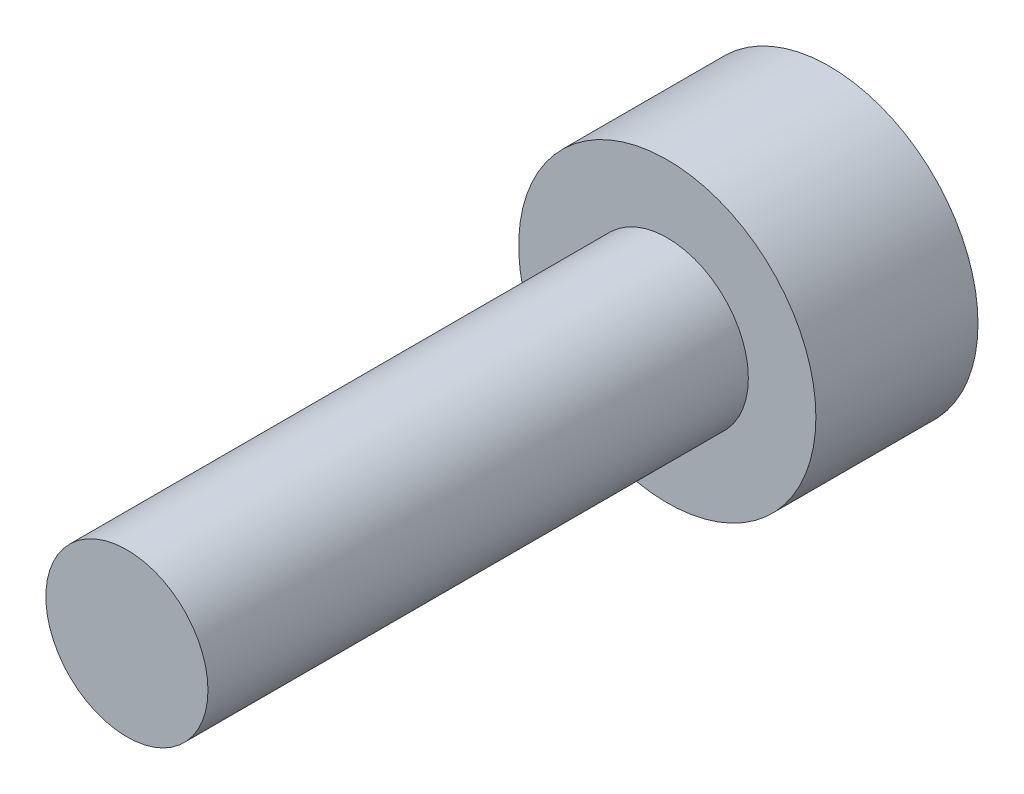
ISO-10303-21;
HEADER;
FILE_DESCRIPTION(('STEP AP214'),'2;1');
FILE_NAME('part.step','',(''),(''),'','','');
FILE_SCHEMA(('AUTOMOTIVE_DESIGN { 1 0 10303 214 1 1 1 1 }'));
ENDSEC;
DATA;
#1=APPLICATION_CONTEXT('core data for automotive mechanical design processes');
#2=APPLICATION_PROTOCOL_DEFINITION('international standard','automotive_design',2000,#1);
#3=PRODUCT_CONTEXT('',#1,'mechanical');
#4=PRODUCT('Part','Part','',(#3));
#5=PRODUCT_RELATED_PRODUCT_CATEGORY('part','',(#4));
#6=PRODUCT_DEFINITION_FORMATION('','',#4);
#7=PRODUCT_DEFINITION_CONTEXT('part definition',#1,'design');
#8=PRODUCT_DEFINITION('design','',#6,#7);
#9=PRODUCT_DEFINITION_SHAPE('','',#8);
#10=(LENGTH_UNIT() NAMED_UNIT(*) SI_UNIT(.MILLI.,.METRE.));
#11=(NAMED_UNIT(*) PLANE_ANGLE_UNIT() SI_UNIT($,.RADIAN.));
#12=(NAMED_UNIT(*) SI_UNIT($,.STERADIAN.) SOLID_ANGLE_UNIT());
#13=UNCERTAINTY_MEASURE_WITH_UNIT(LENGTH_MEASURE(1.E-05),#10,'distance_accuracy_value','');
#14=(GEOMETRIC_REPRESENTATION_CONTEXT(3) GLOBAL_UNCERTAINTY_ASSIGNED_CONTEXT((#13)) GLOBAL_UNIT_ASSIGNED_CONTEXT((#10,
#11,#12)) REPRESENTATION_CONTEXT('',''));
#15=CARTESIAN_POINT('',(0.,0.,0.));
#16=DIRECTION('',(0.,0.,1.));
#17=DIRECTION('',(1.,0.,0.));
#18=AXIS2_PLACEMENT_3D('',#15,#16,#17);
#19=CARTESIAN_POINT('',(0.,0.,3.));
#20=DIRECTION('',(0.,0.,1.));
#21=DIRECTION('',(1.,0.,0.));
#22=AXIS2_PLACEMENT_3D('',#19,#20,#21);
#23=PLANE('',#22);
#24=CARTESIAN_POINT('',(0.,0.,3.));
#25=DIRECTION('',(0.,0.,1.));
#26=DIRECTION('',(1.,0.,0.));
#27=AXIS2_PLACEMENT_3D('',#24,#25,#26);
#28=CIRCLE('',#27,2.75);
#29=CARTESIAN_POINT('',(2.75,0.,3.));
#30=VERTEX_POINT('',#29);
#31=EDGE_CURVE('E11',#30,#30,#28,.T.);
#32=ORIENTED_EDGE('',*,*,#31,.T.);
#33=EDGE_LOOP('',(#32));
#34=FACE_BOUND('',#33,.T.);
#35=CARTESIAN_POINT('',(0.,0.,3.));
#36=DIRECTION('',(0.,0.,1.));
#37=DIRECTION('',(1.,0.,0.));
#38=AXIS2_PLACEMENT_3D('',#35,#36,#37);
#39=CIRCLE('',#38,1.5);
#40=CARTESIAN_POINT('',(1.5,0.,3.));
#41=VERTEX_POINT('',#40);
#42=EDGE_CURVE('E139',#41,#41,#39,.T.);
#43=ORIENTED_EDGE('',*,*,#42,.F.);
#44=EDGE_LOOP('',(#43));
#45=FACE_BOUND('',#44,.T.);
#46=ADVANCED_FACE('F37',(#34,#45),#23,.T.);
#47=CARTESIAN_POINT('',(0.,0.,3.));
#48=DIRECTION('',(0.,0.,-1.));
#49=DIRECTION('',(-1.,0.,0.));
#50=AXIS2_PLACEMENT_3D('',#47,#48,#49);
#51=CYLINDRICAL_SURFACE('',#50,2.75);
#52=ORIENTED_EDGE('',*,*,#31,.F.);
#53=EDGE_LOOP('',(#52));
#54=FACE_BOUND('',#53,.T.);
#55=CARTESIAN_POINT('',(0.,0.,0.));
#56=DIRECTION('',(0.,0.,1.));
#57=DIRECTION('',(1.,0.,0.));
#58=AXIS2_PLACEMENT_3D('',#55,#56,#57);
#59=CIRCLE('',#58,2.75);
#60=CARTESIAN_POINT('',(2.75,0.,0.));
#61=VERTEX_POINT('',#60);
#62=EDGE_CURVE('E41',#61,#61,#59,.T.);
#63=ORIENTED_EDGE('',*,*,#62,.T.);
#64=EDGE_LOOP('',(#63));
#65=FACE_BOUND('',#64,.T.);
#66=ADVANCED_FACE('F39',(#54,#65),#51,.T.);
#67=CARTESIAN_POINT('',(0.,0.,0.));
#68=DIRECTION('',(0.,0.,1.));
#69=DIRECTION('',(1.,0.,0.));
#70=AXIS2_PLACEMENT_3D('',#67,#68,#69);
#71=PLANE('',#70);
#72=DIRECTION('',(0.284171427874139,0.958773487107342,0.));
#73=VECTOR('',#72,1.);
#74=CARTESIAN_POINT('',(-1.66357981000848,-0.399103763087742,0.));
#75=LINE('',#74,#73);
#76=CARTESIAN_POINT('',(-1.66357981000848,-0.399103763087742,0.));
#77=VERTEX_POINT('',#76);
#78=CARTESIAN_POINT('',(-1.17742390258419,1.24115049514637,0.));
#79=VERTEX_POINT('',#78);
#80=EDGE_CURVE('E126',#77,#79,#75,.T.);
#81=ORIENTED_EDGE('',*,*,#80,.F.);
#82=DIRECTION('',(-0.688236482372881,0.725486419122372,0.));
#83=VECTOR('',#82,1.);
#84=CARTESIAN_POINT('',(-0.48615590742429,-1.64025425823411,0.));
#85=LINE('',#84,#83);
#86=CARTESIAN_POINT('',(-0.48615590742429,-1.64025425823411,0.));
#87=VERTEX_POINT('',#86);
#88=EDGE_CURVE('E52',#87,#77,#85,.T.);
#89=ORIENTED_EDGE('',*,*,#88,.F.);
#90=DIRECTION('',(-0.97240791024702,-0.23328706798497,0.));
#91=VECTOR('',#90,1.);
#92=CARTESIAN_POINT('',(1.17742390258419,-1.24115049514637,0.));
#93=LINE('',#92,#91);
#94=CARTESIAN_POINT('',(1.17742390258419,-1.24115049514637,0.));
#95=VERTEX_POINT('',#94);
#96=EDGE_CURVE('E135',#95,#87,#93,.T.);
#97=ORIENTED_EDGE('',*,*,#96,.F.);
#98=DIRECTION('',(-0.284171427874138,-0.958773487107342,0.));
#99=VECTOR('',#98,1.);
#100=CARTESIAN_POINT('',(1.66357981000848,0.399103763087743,0.));
#101=LINE('',#100,#99);
#102=CARTESIAN_POINT('',(1.66357981000848,0.399103763087743,0.));
#103=VERTEX_POINT('',#102);
#104=EDGE_CURVE('E133',#103,#95,#101,.T.);
#105=ORIENTED_EDGE('',*,*,#104,.F.);
#106=DIRECTION('',(0.688236482372881,-0.725486419122372,0.));
#107=VECTOR('',#106,1.);
#108=CARTESIAN_POINT('',(0.486155907424292,1.64025425823411,0.));
#109=LINE('',#108,#107);
#110=CARTESIAN_POINT('',(0.486155907424292,1.64025425823411,0.));
#111=VERTEX_POINT('',#110);
#112=EDGE_CURVE('E100',#111,#103,#109,.T.);
#113=ORIENTED_EDGE('',*,*,#112,.F.);
#114=DIRECTION('',(0.97240791024702,0.23328706798497,0.));
#115=VECTOR('',#114,1.);
#116=CARTESIAN_POINT('',(-1.17742390258419,1.24115049514637,0.));
#117=LINE('',#116,#115);
#118=EDGE_CURVE('E129',#79,#111,#117,.T.);
#119=ORIENTED_EDGE('',*,*,#118,.F.);
#120=EDGE_LOOP('',(#81,#89,#97,#105,#113,#119));
#121=FACE_BOUND('',#120,.T.);
#122=ORIENTED_EDGE('',*,*,#62,.F.);
#123=EDGE_LOOP('',(#122));
#124=FACE_BOUND('',#123,.T.);
#125=ADVANCED_FACE('F159',(#121,#124),#71,.F.);
#126=CARTESIAN_POINT('',(0.,0.,13.));
#127=DIRECTION('',(0.,0.,-1.));
#128=DIRECTION('',(-1.,0.,0.));
#129=AXIS2_PLACEMENT_3D('',#126,#127,#128);
#130=CYLINDRICAL_SURFACE('',#129,1.5);
#131=CARTESIAN_POINT('',(0.,0.,13.));
#132=DIRECTION('',(0.,0.,1.));
#133=DIRECTION('',(1.,0.,0.));
#134=AXIS2_PLACEMENT_3D('',#131,#132,#133);
#135=CIRCLE('',#134,1.5);
#136=CARTESIAN_POINT('',(1.5,0.,13.));
#137=VERTEX_POINT('',#136);
#138=EDGE_CURVE('E145',#137,#137,#135,.T.);
#139=ORIENTED_EDGE('',*,*,#138,.F.);
#140=EDGE_LOOP('',(#139));
#141=FACE_BOUND('',#140,.T.);
#142=ORIENTED_EDGE('',*,*,#42,.T.);
#143=EDGE_LOOP('',(#142));
#144=FACE_BOUND('',#143,.T.);
#145=ADVANCED_FACE('F151',(#141,#144),#130,.T.);
#146=CARTESIAN_POINT('',(0.,0.,13.));
#147=DIRECTION('',(0.,0.,1.));
#148=DIRECTION('',(1.,0.,0.));
#149=AXIS2_PLACEMENT_3D('',#146,#147,#148);
#150=PLANE('',#149);
#151=ORIENTED_EDGE('',*,*,#138,.T.);
#152=EDGE_LOOP('',(#151));
#153=FACE_BOUND('',#152,.T.);
#154=ADVANCED_FACE('F168',(#153),#150,.T.);
#155=CARTESIAN_POINT('',(-0.48615590742429,-1.64025425823411,2.));
#156=DIRECTION('',(-0.725486419122372,-0.688236482372881,0.));
#157=DIRECTION('',(0.688236482372881,-0.725486419122372,0.));
#158=AXIS2_PLACEMENT_3D('',#155,#156,#157);
#159=PLANE('',#158);
#160=ORIENTED_EDGE('',*,*,#88,.T.);
#161=DIRECTION('',(0.,0.,-1.));
#162=VECTOR('',#161,1.);
#163=CARTESIAN_POINT('',(-1.66357981000848,-0.399103763087742,2.));
#164=LINE('',#163,#162);
#165=CARTESIAN_POINT('',(-1.66357981000848,-0.399103763087742,2.));
#166=VERTEX_POINT('',#165);
#167=EDGE_CURVE('E82',#166,#77,#164,.T.);
#168=ORIENTED_EDGE('',*,*,#167,.F.);
#169=DIRECTION('',(-0.688236482372881,0.725486419122372,0.));
#170=VECTOR('',#169,1.);
#171=CARTESIAN_POINT('',(-0.48615590742429,-1.64025425823411,2.));
#172=LINE('',#171,#170);
#173=CARTESIAN_POINT('',(-0.48615590742429,-1.64025425823411,2.));
#174=VERTEX_POINT('',#173);
#175=EDGE_CURVE('E137',#174,#166,#172,.T.);
#176=ORIENTED_EDGE('',*,*,#175,.F.);
#177=DIRECTION('',(0.,0.,-1.));
#178=VECTOR('',#177,1.);
#179=CARTESIAN_POINT('',(-0.48615590742429,-1.64025425823411,2.));
#180=LINE('',#179,#178);
#181=EDGE_CURVE('E60',#174,#87,#180,.T.);
#182=ORIENTED_EDGE('',*,*,#181,.T.);
#183=EDGE_LOOP('',(#160,#168,#176,#182));
#184=FACE_BOUND('',#183,.T.);
#185=ADVANCED_FACE('F180',(#184),#159,.F.);
#186=CARTESIAN_POINT('',(1.17742390258419,-1.24115049514637,2.));
#187=DIRECTION('',(0.23328706798497,-0.97240791024702,0.));
#188=DIRECTION('',(0.97240791024702,0.23328706798497,0.));
#189=AXIS2_PLACEMENT_3D('',#186,#187,#188);
#190=PLANE('',#189);
#191=ORIENTED_EDGE('',*,*,#96,.T.);
#192=ORIENTED_EDGE('',*,*,#181,.F.);
#193=DIRECTION('',(-0.97240791024702,-0.23328706798497,0.));
#194=VECTOR('',#193,1.);
#195=CARTESIAN_POINT('',(1.17742390258419,-1.24115049514637,2.));
#196=LINE('',#195,#194);
#197=CARTESIAN_POINT('',(1.17742390258419,-1.24115049514637,2.));
#198=VERTEX_POINT('',#197);
#199=EDGE_CURVE('E112',#198,#174,#196,.T.);
#200=ORIENTED_EDGE('',*,*,#199,.F.);
#201=DIRECTION('',(0.,0.,-1.));
#202=VECTOR('',#201,1.);
#203=CARTESIAN_POINT('',(1.17742390258419,-1.24115049514637,2.));
#204=LINE('',#203,#202);
#205=EDGE_CURVE('E104',#198,#95,#204,.T.);
#206=ORIENTED_EDGE('',*,*,#205,.T.);
#207=EDGE_LOOP('',(#191,#192,#200,#206));
#208=FACE_BOUND('',#207,.T.);
#209=ADVANCED_FACE('F182',(#208),#190,.F.);
#210=CARTESIAN_POINT('',(1.66357981000848,0.399103763087743,2.));
#211=DIRECTION('',(0.958773487107343,-0.284171427874138,0.));
#212=DIRECTION('',(0.284171427874138,0.958773487107343,0.));
#213=AXIS2_PLACEMENT_3D('',#210,#211,#212);
#214=PLANE('',#213);
#215=ORIENTED_EDGE('',*,*,#104,.T.);
#216=ORIENTED_EDGE('',*,*,#205,.F.);
#217=DIRECTION('',(-0.284171427874138,-0.958773487107342,0.));
#218=VECTOR('',#217,1.);
#219=CARTESIAN_POINT('',(1.66357981000848,0.399103763087743,2.));
#220=LINE('',#219,#218);
#221=CARTESIAN_POINT('',(1.66357981000848,0.399103763087743,2.));
#222=VERTEX_POINT('',#221);
#223=EDGE_CURVE('E108',#222,#198,#220,.T.);
#224=ORIENTED_EDGE('',*,*,#223,.F.);
#225=DIRECTION('',(0.,0.,-1.));
#226=VECTOR('',#225,1.);
#227=CARTESIAN_POINT('',(1.66357981000848,0.399103763087743,2.));
#228=LINE('',#227,#226);
#229=EDGE_CURVE('E93',#222,#103,#228,.T.);
#230=ORIENTED_EDGE('',*,*,#229,.T.);
#231=EDGE_LOOP('',(#215,#216,#224,#230));
#232=FACE_BOUND('',#231,.T.);
#233=ADVANCED_FACE('F109',(#232),#214,.F.);
#234=CARTESIAN_POINT('',(0.486155907424292,1.64025425823411,2.));
#235=DIRECTION('',(0.725486419122372,0.688236482372881,0.));
#236=DIRECTION('',(-0.688236482372881,0.725486419122372,0.));
#237=AXIS2_PLACEMENT_3D('',#234,#235,#236);
#238=PLANE('',#237);
#239=ORIENTED_EDGE('',*,*,#112,.T.);
#240=ORIENTED_EDGE('',*,*,#229,.F.);
#241=DIRECTION('',(0.688236482372881,-0.725486419122372,0.));
#242=VECTOR('',#241,1.);
#243=CARTESIAN_POINT('',(0.486155907424292,1.64025425823411,2.));
#244=LINE('',#243,#242);
#245=CARTESIAN_POINT('',(0.486155907424292,1.64025425823411,2.));
#246=VERTEX_POINT('',#245);
#247=EDGE_CURVE('E97',#246,#222,#244,.T.);
#248=ORIENTED_EDGE('',*,*,#247,.F.);
#249=DIRECTION('',(0.,0.,-1.));
#250=VECTOR('',#249,1.);
#251=CARTESIAN_POINT('',(0.486155907424292,1.64025425823411,2.));
#252=LINE('',#251,#250);
#253=EDGE_CURVE('E105',#246,#111,#252,.T.);
#254=ORIENTED_EDGE('',*,*,#253,.T.);
#255=EDGE_LOOP('',(#239,#240,#248,#254));
#256=FACE_BOUND('',#255,.T.);
#257=ADVANCED_FACE('F95',(#256),#238,.F.);
#258=CARTESIAN_POINT('',(-1.17742390258419,1.24115049514637,2.));
#259=DIRECTION('',(-0.23328706798497,0.97240791024702,0.));
#260=DIRECTION('',(-0.97240791024702,-0.23328706798497,0.));
#261=AXIS2_PLACEMENT_3D('',#258,#259,#260);
#262=PLANE('',#261);
#263=ORIENTED_EDGE('',*,*,#118,.T.);
#264=ORIENTED_EDGE('',*,*,#253,.F.);
#265=DIRECTION('',(0.97240791024702,0.23328706798497,0.));
#266=VECTOR('',#265,1.);
#267=CARTESIAN_POINT('',(-1.17742390258419,1.24115049514637,2.));
#268=LINE('',#267,#266);
#269=CARTESIAN_POINT('',(-1.17742390258419,1.24115049514637,2.));
#270=VERTEX_POINT('',#269);
#271=EDGE_CURVE('E118',#270,#246,#268,.T.);
#272=ORIENTED_EDGE('',*,*,#271,.F.);
#273=DIRECTION('',(0.,0.,-1.));
#274=VECTOR('',#273,1.);
#275=CARTESIAN_POINT('',(-1.17742390258419,1.24115049514637,2.));
#276=LINE('',#275,#274);
#277=EDGE_CURVE('E142',#270,#79,#276,.T.);
#278=ORIENTED_EDGE('',*,*,#277,.T.);
#279=EDGE_LOOP('',(#263,#264,#272,#278));
#280=FACE_BOUND('',#279,.T.);
#281=ADVANCED_FACE('F193',(#280),#262,.F.);
#282=CARTESIAN_POINT('',(-1.66357981000848,-0.399103763087742,2.));
#283=DIRECTION('',(-0.958773487107342,0.284171427874139,0.));
#284=DIRECTION('',(-0.284171427874139,-0.958773487107342,0.));
#285=AXIS2_PLACEMENT_3D('',#282,#283,#284);
#286=PLANE('',#285);
#287=ORIENTED_EDGE('',*,*,#80,.T.);
#288=ORIENTED_EDGE('',*,*,#277,.F.);
#289=DIRECTION('',(0.284171427874139,0.958773487107342,0.));
#290=VECTOR('',#289,1.);
#291=CARTESIAN_POINT('',(-1.66357981000848,-0.399103763087742,2.));
#292=LINE('',#291,#290);
#293=EDGE_CURVE('E120',#166,#270,#292,.T.);
#294=ORIENTED_EDGE('',*,*,#293,.F.);
#295=ORIENTED_EDGE('',*,*,#167,.T.);
#296=EDGE_LOOP('',(#287,#288,#294,#295));
#297=FACE_BOUND('',#296,.T.);
#298=ADVANCED_FACE('F178',(#297),#286,.F.);
#299=CARTESIAN_POINT('',(0.,0.,2.));
#300=DIRECTION('',(0.,0.,-1.));
#301=DIRECTION('',(-1.,0.,0.));
#302=AXIS2_PLACEMENT_3D('',#299,#300,#301);
#303=PLANE('',#302);
#304=ORIENTED_EDGE('',*,*,#175,.T.);
#305=ORIENTED_EDGE('',*,*,#293,.T.);
#306=ORIENTED_EDGE('',*,*,#271,.T.);
#307=ORIENTED_EDGE('',*,*,#247,.T.);
#308=ORIENTED_EDGE('',*,*,#223,.T.);
#309=ORIENTED_EDGE('',*,*,#199,.T.);
#310=EDGE_LOOP('',(#304,#305,#306,#307,#308,#309));
#311=FACE_BOUND('',#310,.T.);
#312=ADVANCED_FACE('F115',(#311),#303,.T.);
#313=CLOSED_SHELL('',(#46,#66,#125,#145,#154,#185,#209,#233,#257,#281,#298,#312));
#314=MANIFOLD_SOLID_BREP('B2',#313);
#315=ADVANCED_BREP_SHAPE_REPRESENTATION('',(#18,#314),#14);
#316=SHAPE_DEFINITION_REPRESENTATION(#9,#315);
ENDSEC;
END-ISO-10303-21;
